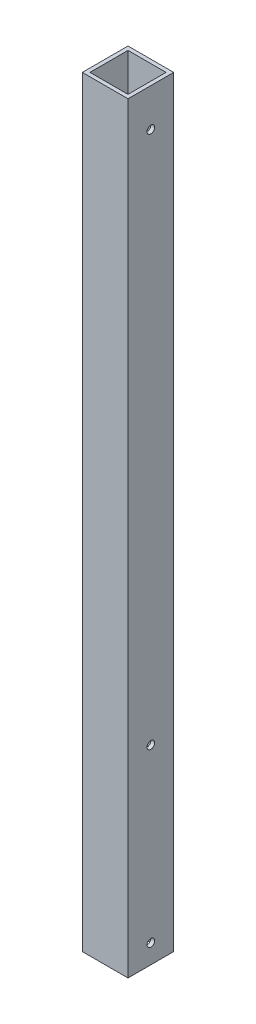
ISO-10303-21;
HEADER;
FILE_DESCRIPTION(('STEP AP214'),'2;1');
FILE_NAME('part.step','',(''),(''),'','','');
FILE_SCHEMA(('AUTOMOTIVE_DESIGN { 1 0 10303 214 1 1 1 1 }'));
ENDSEC;
DATA;
#1=APPLICATION_CONTEXT('core data for automotive mechanical design processes');
#2=APPLICATION_PROTOCOL_DEFINITION('international standard','automotive_design',2000,#1);
#3=PRODUCT_CONTEXT('',#1,'mechanical');
#4=PRODUCT('Part','Part','',(#3));
#5=PRODUCT_RELATED_PRODUCT_CATEGORY('part','',(#4));
#6=PRODUCT_DEFINITION_FORMATION('','',#4);
#7=PRODUCT_DEFINITION_CONTEXT('part definition',#1,'design');
#8=PRODUCT_DEFINITION('design','',#6,#7);
#9=PRODUCT_DEFINITION_SHAPE('','',#8);
#10=(LENGTH_UNIT() NAMED_UNIT(*) SI_UNIT(.MILLI.,.METRE.));
#11=(NAMED_UNIT(*) PLANE_ANGLE_UNIT() SI_UNIT($,.RADIAN.));
#12=(NAMED_UNIT(*) SI_UNIT($,.STERADIAN.) SOLID_ANGLE_UNIT());
#13=UNCERTAINTY_MEASURE_WITH_UNIT(LENGTH_MEASURE(1.E-05),#10,'distance_accuracy_value','');
#14=(GEOMETRIC_REPRESENTATION_CONTEXT(3) GLOBAL_UNCERTAINTY_ASSIGNED_CONTEXT((#13)) GLOBAL_UNIT_ASSIGNED_CONTEXT((#10,
#11,#12)) REPRESENTATION_CONTEXT('',''));
#15=CARTESIAN_POINT('',(0.,0.,0.));
#16=DIRECTION('',(0.,0.,1.));
#17=DIRECTION('',(1.,0.,0.));
#18=AXIS2_PLACEMENT_3D('',#15,#16,#17);
#19=CARTESIAN_POINT('',(0.,200.,0.));
#20=DIRECTION('',(0.,-1.,0.));
#21=DIRECTION('',(0.,0.,-1.));
#22=AXIS2_PLACEMENT_3D('',#19,#20,#21);
#23=PLANE('',#22);
#24=DIRECTION('',(0.,0.,-1.));
#25=VECTOR('',#24,1.);
#26=CARTESIAN_POINT('',(0.999999999999999,200.,-0.999999999999999));
#27=LINE('',#26,#25);
#28=CARTESIAN_POINT('',(0.999999999999999,200.,-0.999999999999999));
#29=VERTEX_POINT('',#28);
#30=CARTESIAN_POINT('',(0.999999999999999,200.,-11.));
#31=VERTEX_POINT('',#30);
#32=EDGE_CURVE('E117',#29,#31,#27,.T.);
#33=ORIENTED_EDGE('',*,*,#32,.T.);
#34=DIRECTION('',(1.,0.,0.));
#35=VECTOR('',#34,1.);
#36=CARTESIAN_POINT('',(0.999999999999999,200.,-11.));
#37=LINE('',#36,#35);
#38=CARTESIAN_POINT('',(11.,200.,-11.));
#39=VERTEX_POINT('',#38);
#40=EDGE_CURVE('E124',#31,#39,#37,.T.);
#41=ORIENTED_EDGE('',*,*,#40,.T.);
#42=DIRECTION('',(0.,0.,1.));
#43=VECTOR('',#42,1.);
#44=CARTESIAN_POINT('',(11.,200.,-11.));
#45=LINE('',#44,#43);
#46=CARTESIAN_POINT('',(11.,200.,-0.999999999999999));
#47=VERTEX_POINT('',#46);
#48=EDGE_CURVE('E129',#39,#47,#45,.T.);
#49=ORIENTED_EDGE('',*,*,#48,.T.);
#50=DIRECTION('',(-1.,0.,0.));
#51=VECTOR('',#50,1.);
#52=CARTESIAN_POINT('',(11.,200.,-0.999999999999999));
#53=LINE('',#52,#51);
#54=EDGE_CURVE('E56',#47,#29,#53,.T.);
#55=ORIENTED_EDGE('',*,*,#54,.T.);
#56=EDGE_LOOP('',(#33,#41,#49,#55));
#57=FACE_BOUND('',#56,.T.);
#58=DIRECTION('',(0.,0.,1.));
#59=VECTOR('',#58,1.);
#60=CARTESIAN_POINT('',(0.,200.,0.));
#61=LINE('',#60,#59);
#62=CARTESIAN_POINT('',(0.,200.,-12.));
#63=VERTEX_POINT('',#62);
#64=CARTESIAN_POINT('',(0.,200.,0.));
#65=VERTEX_POINT('',#64);
#66=EDGE_CURVE('E168',#63,#65,#61,.T.);
#67=ORIENTED_EDGE('',*,*,#66,.T.);
#68=DIRECTION('',(1.,0.,0.));
#69=VECTOR('',#68,1.);
#70=CARTESIAN_POINT('',(0.,200.,0.));
#71=LINE('',#70,#69);
#72=CARTESIAN_POINT('',(12.,200.,0.));
#73=VERTEX_POINT('',#72);
#74=EDGE_CURVE('E172',#65,#73,#71,.T.);
#75=ORIENTED_EDGE('',*,*,#74,.T.);
#76=DIRECTION('',(0.,0.,-1.));
#77=VECTOR('',#76,1.);
#78=CARTESIAN_POINT('',(12.,200.,0.));
#79=LINE('',#78,#77);
#80=CARTESIAN_POINT('',(12.,200.,-12.));
#81=VERTEX_POINT('',#80);
#82=EDGE_CURVE('E176',#73,#81,#79,.T.);
#83=ORIENTED_EDGE('',*,*,#82,.T.);
#84=DIRECTION('',(-1.,0.,0.));
#85=VECTOR('',#84,1.);
#86=CARTESIAN_POINT('',(0.,200.,-12.));
#87=LINE('',#86,#85);
#88=EDGE_CURVE('E179',#81,#63,#87,.T.);
#89=ORIENTED_EDGE('',*,*,#88,.T.);
#90=EDGE_LOOP('',(#67,#75,#83,#89));
#91=FACE_BOUND('',#90,.T.);
#92=ADVANCED_FACE('F38',(#57,#91),#23,.F.);
#93=CARTESIAN_POINT('',(0.,0.,0.));
#94=DIRECTION('',(0.,-1.,0.));
#95=DIRECTION('',(0.,0.,-1.));
#96=AXIS2_PLACEMENT_3D('',#93,#94,#95);
#97=PLANE('',#96);
#98=DIRECTION('',(1.,0.,0.));
#99=VECTOR('',#98,1.);
#100=CARTESIAN_POINT('',(0.999999999999999,0.,-11.));
#101=LINE('',#100,#99);
#102=CARTESIAN_POINT('',(0.999999999999999,0.,-11.));
#103=VERTEX_POINT('',#102);
#104=CARTESIAN_POINT('',(11.,0.,-11.));
#105=VERTEX_POINT('',#104);
#106=EDGE_CURVE('E64',#103,#105,#101,.T.);
#107=ORIENTED_EDGE('',*,*,#106,.F.);
#108=DIRECTION('',(0.,0.,-1.));
#109=VECTOR('',#108,1.);
#110=CARTESIAN_POINT('',(0.999999999999999,0.,-0.999999999999999));
#111=LINE('',#110,#109);
#112=CARTESIAN_POINT('',(0.999999999999999,0.,-0.999999999999999));
#113=VERTEX_POINT('',#112);
#114=EDGE_CURVE('E145',#113,#103,#111,.T.);
#115=ORIENTED_EDGE('',*,*,#114,.F.);
#116=DIRECTION('',(-1.,0.,0.));
#117=VECTOR('',#116,1.);
#118=CARTESIAN_POINT('',(11.,0.,-0.999999999999999));
#119=LINE('',#118,#117);
#120=CARTESIAN_POINT('',(11.,0.,-0.999999999999999));
#121=VERTEX_POINT('',#120);
#122=EDGE_CURVE('E108',#121,#113,#119,.T.);
#123=ORIENTED_EDGE('',*,*,#122,.F.);
#124=DIRECTION('',(0.,0.,1.));
#125=VECTOR('',#124,1.);
#126=CARTESIAN_POINT('',(11.,0.,-6.));
#127=LINE('',#126,#125);
#128=EDGE_CURVE('E138',#105,#121,#127,.T.);
#129=ORIENTED_EDGE('',*,*,#128,.F.);
#130=EDGE_LOOP('',(#107,#115,#123,#129));
#131=FACE_BOUND('',#130,.T.);
#132=DIRECTION('',(0.,0.,1.));
#133=VECTOR('',#132,1.);
#134=CARTESIAN_POINT('',(0.,0.,0.));
#135=LINE('',#134,#133);
#136=CARTESIAN_POINT('',(0.,0.,-12.));
#137=VERTEX_POINT('',#136);
#138=CARTESIAN_POINT('',(0.,0.,0.));
#139=VERTEX_POINT('',#138);
#140=EDGE_CURVE('E162',#137,#139,#135,.T.);
#141=ORIENTED_EDGE('',*,*,#140,.F.);
#142=DIRECTION('',(-1.,0.,0.));
#143=VECTOR('',#142,1.);
#144=CARTESIAN_POINT('',(0.,0.,-12.));
#145=LINE('',#144,#143);
#146=CARTESIAN_POINT('',(12.,0.,-12.));
#147=VERTEX_POINT('',#146);
#148=EDGE_CURVE('E173',#147,#137,#145,.T.);
#149=ORIENTED_EDGE('',*,*,#148,.F.);
#150=DIRECTION('',(0.,0.,-1.));
#151=VECTOR('',#150,1.);
#152=CARTESIAN_POINT('',(12.,0.,0.));
#153=LINE('',#152,#151);
#154=CARTESIAN_POINT('',(12.,0.,0.));
#155=VERTEX_POINT('',#154);
#156=EDGE_CURVE('E189',#155,#147,#153,.T.);
#157=ORIENTED_EDGE('',*,*,#156,.F.);
#158=DIRECTION('',(1.,0.,0.));
#159=VECTOR('',#158,1.);
#160=CARTESIAN_POINT('',(0.,0.,0.));
#161=LINE('',#160,#159);
#162=EDGE_CURVE('E186',#139,#155,#161,.T.);
#163=ORIENTED_EDGE('',*,*,#162,.F.);
#164=EDGE_LOOP('',(#141,#149,#157,#163));
#165=FACE_BOUND('',#164,.T.);
#166=ADVANCED_FACE('F260',(#131,#165),#97,.T.);
#167=CARTESIAN_POINT('',(0.,200.,0.));
#168=DIRECTION('',(1.,0.,0.));
#169=DIRECTION('',(0.,0.,-1.));
#170=AXIS2_PLACEMENT_3D('',#167,#168,#169);
#171=PLANE('',#170);
#172=CARTESIAN_POINT('',(0.,50.,-6.));
#173=DIRECTION('',(-1.,0.,0.));
#174=DIRECTION('',(0.,0.,1.));
#175=AXIS2_PLACEMENT_3D('',#172,#173,#174);
#176=CIRCLE('',#175,1.);
#177=CARTESIAN_POINT('',(0.,50.,-5.));
#178=VERTEX_POINT('',#177);
#179=EDGE_CURVE('E231',#178,#178,#176,.T.);
#180=ORIENTED_EDGE('',*,*,#179,.F.);
#181=EDGE_LOOP('',(#180));
#182=FACE_BOUND('',#181,.T.);
#183=CARTESIAN_POINT('',(0.,5.,-6.));
#184=DIRECTION('',(1.,0.,0.));
#185=DIRECTION('',(0.,0.,-1.));
#186=AXIS2_PLACEMENT_3D('',#183,#184,#185);
#187=CIRCLE('',#186,1.);
#188=CARTESIAN_POINT('',(0.,5.,-7.));
#189=VERTEX_POINT('',#188);
#190=EDGE_CURVE('E212',#189,#189,#187,.T.);
#191=ORIENTED_EDGE('',*,*,#190,.T.);
#192=EDGE_LOOP('',(#191));
#193=FACE_BOUND('',#192,.T.);
#194=CARTESIAN_POINT('',(0.,190.,-6.));
#195=DIRECTION('',(-1.,0.,0.));
#196=DIRECTION('',(0.,0.,1.));
#197=AXIS2_PLACEMENT_3D('',#194,#195,#196);
#198=CIRCLE('',#197,1.);
#199=CARTESIAN_POINT('',(0.,190.,-5.));
#200=VERTEX_POINT('',#199);
#201=EDGE_CURVE('E163',#200,#200,#198,.T.);
#202=ORIENTED_EDGE('',*,*,#201,.F.);
#203=EDGE_LOOP('',(#202));
#204=FACE_BOUND('',#203,.T.);
#205=ORIENTED_EDGE('',*,*,#140,.T.);
#206=DIRECTION('',(0.,-1.,0.));
#207=VECTOR('',#206,1.);
#208=CARTESIAN_POINT('',(0.,200.,0.));
#209=LINE('',#208,#207);
#210=EDGE_CURVE('E11',#65,#139,#209,.T.);
#211=ORIENTED_EDGE('',*,*,#210,.F.);
#212=ORIENTED_EDGE('',*,*,#66,.F.);
#213=DIRECTION('',(0.,-1.,0.));
#214=VECTOR('',#213,1.);
#215=CARTESIAN_POINT('',(0.,200.,-12.));
#216=LINE('',#215,#214);
#217=EDGE_CURVE('E182',#63,#137,#216,.T.);
#218=ORIENTED_EDGE('',*,*,#217,.T.);
#219=EDGE_LOOP('',(#205,#211,#212,#218));
#220=FACE_BOUND('',#219,.T.);
#221=ADVANCED_FACE('F40',(#182,#193,#204,#220),#171,.F.);
#222=CARTESIAN_POINT('',(0.,200.,0.));
#223=DIRECTION('',(0.,0.,-1.));
#224=DIRECTION('',(-1.,0.,0.));
#225=AXIS2_PLACEMENT_3D('',#222,#223,#224);
#226=PLANE('',#225);
#227=ORIENTED_EDGE('',*,*,#162,.T.);
#228=DIRECTION('',(0.,-1.,0.));
#229=VECTOR('',#228,1.);
#230=CARTESIAN_POINT('',(12.,200.,0.));
#231=LINE('',#230,#229);
#232=EDGE_CURVE('E48',#73,#155,#231,.T.);
#233=ORIENTED_EDGE('',*,*,#232,.F.);
#234=ORIENTED_EDGE('',*,*,#74,.F.);
#235=ORIENTED_EDGE('',*,*,#210,.T.);
#236=EDGE_LOOP('',(#227,#233,#234,#235));
#237=FACE_BOUND('',#236,.T.);
#238=ADVANCED_FACE('F277',(#237),#226,.F.);
#239=CARTESIAN_POINT('',(12.,200.,0.));
#240=DIRECTION('',(-1.,0.,0.));
#241=DIRECTION('',(0.,0.,1.));
#242=AXIS2_PLACEMENT_3D('',#239,#240,#241);
#243=PLANE('',#242);
#244=CARTESIAN_POINT('',(12.,50.,-6.));
#245=DIRECTION('',(-1.,0.,0.));
#246=DIRECTION('',(0.,0.,1.));
#247=AXIS2_PLACEMENT_3D('',#244,#245,#246);
#248=CIRCLE('',#247,1.);
#249=CARTESIAN_POINT('',(12.,50.,-5.));
#250=VERTEX_POINT('',#249);
#251=EDGE_CURVE('E235',#250,#250,#248,.T.);
#252=ORIENTED_EDGE('',*,*,#251,.T.);
#253=EDGE_LOOP('',(#252));
#254=FACE_BOUND('',#253,.T.);
#255=CARTESIAN_POINT('',(12.,5.,-6.));
#256=DIRECTION('',(1.,0.,0.));
#257=DIRECTION('',(0.,0.,-1.));
#258=AXIS2_PLACEMENT_3D('',#255,#256,#257);
#259=CIRCLE('',#258,1.);
#260=CARTESIAN_POINT('',(12.,5.,-7.));
#261=VERTEX_POINT('',#260);
#262=EDGE_CURVE('E219',#261,#261,#259,.T.);
#263=ORIENTED_EDGE('',*,*,#262,.F.);
#264=EDGE_LOOP('',(#263));
#265=FACE_BOUND('',#264,.T.);
#266=CARTESIAN_POINT('',(12.,190.,-6.));
#267=DIRECTION('',(-1.,0.,0.));
#268=DIRECTION('',(0.,0.,1.));
#269=AXIS2_PLACEMENT_3D('',#266,#267,#268);
#270=CIRCLE('',#269,1.);
#271=CARTESIAN_POINT('',(12.,190.,-5.));
#272=VERTEX_POINT('',#271);
#273=EDGE_CURVE('E158',#272,#272,#270,.T.);
#274=ORIENTED_EDGE('',*,*,#273,.T.);
#275=EDGE_LOOP('',(#274));
#276=FACE_BOUND('',#275,.T.);
#277=ORIENTED_EDGE('',*,*,#156,.T.);
#278=DIRECTION('',(0.,-1.,0.));
#279=VECTOR('',#278,1.);
#280=CARTESIAN_POINT('',(12.,200.,-12.));
#281=LINE('',#280,#279);
#282=EDGE_CURVE('E197',#81,#147,#281,.T.);
#283=ORIENTED_EDGE('',*,*,#282,.F.);
#284=ORIENTED_EDGE('',*,*,#82,.F.);
#285=ORIENTED_EDGE('',*,*,#232,.T.);
#286=EDGE_LOOP('',(#277,#283,#284,#285));
#287=FACE_BOUND('',#286,.T.);
#288=ADVANCED_FACE('F274',(#254,#265,#276,#287),#243,.F.);
#289=CARTESIAN_POINT('',(0.,200.,-12.));
#290=DIRECTION('',(0.,0.,1.));
#291=DIRECTION('',(1.,0.,0.));
#292=AXIS2_PLACEMENT_3D('',#289,#290,#291);
#293=PLANE('',#292);
#294=ORIENTED_EDGE('',*,*,#148,.T.);
#295=ORIENTED_EDGE('',*,*,#217,.F.);
#296=ORIENTED_EDGE('',*,*,#88,.F.);
#297=ORIENTED_EDGE('',*,*,#282,.T.);
#298=EDGE_LOOP('',(#294,#295,#296,#297));
#299=FACE_BOUND('',#298,.T.);
#300=ADVANCED_FACE('F271',(#299),#293,.F.);
#301=CARTESIAN_POINT('',(12.,190.,-6.));
#302=DIRECTION('',(-1.,0.,0.));
#303=DIRECTION('',(0.,0.,1.));
#304=AXIS2_PLACEMENT_3D('',#301,#302,#303);
#305=CYLINDRICAL_SURFACE('',#304,1.);
#306=CARTESIAN_POINT('',(11.,190.,-6.));
#307=DIRECTION('',(1.,0.,0.));
#308=DIRECTION('',(0.,0.,-1.));
#309=AXIS2_PLACEMENT_3D('',#306,#307,#308);
#310=CIRCLE('',#309,1.);
#311=CARTESIAN_POINT('',(11.,190.,-7.));
#312=VERTEX_POINT('',#311);
#313=EDGE_CURVE('E167',#312,#312,#310,.F.);
#314=ORIENTED_EDGE('',*,*,#313,.T.);
#315=EDGE_LOOP('',(#314));
#316=FACE_BOUND('',#315,.T.);
#317=ORIENTED_EDGE('',*,*,#273,.F.);
#318=EDGE_LOOP('',(#317));
#319=FACE_BOUND('',#318,.T.);
#320=ADVANCED_FACE('F268',(#316,#319),#305,.F.);
#321=CARTESIAN_POINT('',(0.999999999999999,190.,-6.));
#322=DIRECTION('',(-1.,0.,0.));
#323=DIRECTION('',(0.,0.,1.));
#324=AXIS2_PLACEMENT_3D('',#321,#322,#323);
#325=CIRCLE('',#324,1.);
#326=CARTESIAN_POINT('',(0.999999999999999,190.,-5.));
#327=VERTEX_POINT('',#326);
#328=EDGE_CURVE('E153',#327,#327,#325,.F.);
#329=ORIENTED_EDGE('',*,*,#328,.T.);
#330=EDGE_LOOP('',(#329));
#331=FACE_BOUND('',#330,.T.);
#332=ORIENTED_EDGE('',*,*,#201,.T.);
#333=EDGE_LOOP('',(#332));
#334=FACE_BOUND('',#333,.T.);
#335=ADVANCED_FACE('F305',(#331,#334),#305,.F.);
#336=CARTESIAN_POINT('',(11.,200.,-6.));
#337=DIRECTION('',(1.,0.,0.));
#338=DIRECTION('',(0.,0.,-1.));
#339=AXIS2_PLACEMENT_3D('',#336,#337,#338);
#340=PLANE('',#339);
#341=CARTESIAN_POINT('',(11.,50.,-6.));
#342=DIRECTION('',(1.,0.,0.));
#343=DIRECTION('',(0.,0.,-1.));
#344=AXIS2_PLACEMENT_3D('',#341,#342,#343);
#345=CIRCLE('',#344,1.);
#346=CARTESIAN_POINT('',(11.,50.,-7.));
#347=VERTEX_POINT('',#346);
#348=EDGE_CURVE('E225',#347,#347,#345,.T.);
#349=ORIENTED_EDGE('',*,*,#348,.T.);
#350=EDGE_LOOP('',(#349));
#351=FACE_BOUND('',#350,.T.);
#352=CARTESIAN_POINT('',(11.,5.,-6.));
#353=DIRECTION('',(1.,0.,0.));
#354=DIRECTION('',(0.,0.,-1.));
#355=AXIS2_PLACEMENT_3D('',#352,#353,#354);
#356=CIRCLE('',#355,1.);
#357=CARTESIAN_POINT('',(11.,5.,-7.));
#358=VERTEX_POINT('',#357);
#359=EDGE_CURVE('E142',#358,#358,#356,.T.);
#360=ORIENTED_EDGE('',*,*,#359,.T.);
#361=EDGE_LOOP('',(#360));
#362=FACE_BOUND('',#361,.T.);
#363=ORIENTED_EDGE('',*,*,#128,.T.);
#364=DIRECTION('',(0.,-1.,0.));
#365=VECTOR('',#364,1.);
#366=CARTESIAN_POINT('',(11.,200.,-0.999999999999999));
#367=LINE('',#366,#365);
#368=EDGE_CURVE('E114',#47,#121,#367,.T.);
#369=ORIENTED_EDGE('',*,*,#368,.F.);
#370=ORIENTED_EDGE('',*,*,#48,.F.);
#371=DIRECTION('',(0.,-1.,0.));
#372=VECTOR('',#371,1.);
#373=CARTESIAN_POINT('',(11.,200.,-11.));
#374=LINE('',#373,#372);
#375=EDGE_CURVE('E150',#39,#105,#374,.T.);
#376=ORIENTED_EDGE('',*,*,#375,.T.);
#377=EDGE_LOOP('',(#363,#369,#370,#376));
#378=FACE_BOUND('',#377,.T.);
#379=ORIENTED_EDGE('',*,*,#313,.F.);
#380=EDGE_LOOP('',(#379));
#381=FACE_BOUND('',#380,.T.);
#382=ADVANCED_FACE('F307',(#351,#362,#378,#381),#340,.F.);
#383=CARTESIAN_POINT('',(0.999999999999999,200.,-0.999999999999999));
#384=DIRECTION('',(-1.,0.,0.));
#385=DIRECTION('',(0.,0.,1.));
#386=AXIS2_PLACEMENT_3D('',#383,#384,#385);
#387=PLANE('',#386);
#388=CARTESIAN_POINT('',(0.999999999999999,50.,-6.));
#389=DIRECTION('',(-1.,0.,0.));
#390=DIRECTION('',(0.,0.,1.));
#391=AXIS2_PLACEMENT_3D('',#388,#389,#390);
#392=CIRCLE('',#391,1.);
#393=CARTESIAN_POINT('',(0.999999999999999,50.,-5.));
#394=VERTEX_POINT('',#393);
#395=EDGE_CURVE('E42',#394,#394,#392,.T.);
#396=ORIENTED_EDGE('',*,*,#395,.T.);
#397=EDGE_LOOP('',(#396));
#398=FACE_BOUND('',#397,.T.);
#399=CARTESIAN_POINT('',(0.999999999999999,5.,-6.));
#400=DIRECTION('',(-1.,0.,0.));
#401=DIRECTION('',(0.,0.,1.));
#402=AXIS2_PLACEMENT_3D('',#399,#400,#401);
#403=CIRCLE('',#402,1.);
#404=CARTESIAN_POINT('',(0.999999999999999,5.,-5.));
#405=VERTEX_POINT('',#404);
#406=EDGE_CURVE('E209',#405,#405,#403,.T.);
#407=ORIENTED_EDGE('',*,*,#406,.T.);
#408=EDGE_LOOP('',(#407));
#409=FACE_BOUND('',#408,.T.);
#410=ORIENTED_EDGE('',*,*,#114,.T.);
#411=DIRECTION('',(0.,-1.,0.));
#412=VECTOR('',#411,1.);
#413=CARTESIAN_POINT('',(0.999999999999999,200.,-11.));
#414=LINE('',#413,#412);
#415=EDGE_CURVE('E113',#31,#103,#414,.T.);
#416=ORIENTED_EDGE('',*,*,#415,.F.);
#417=ORIENTED_EDGE('',*,*,#32,.F.);
#418=DIRECTION('',(0.,-1.,0.));
#419=VECTOR('',#418,1.);
#420=CARTESIAN_POINT('',(0.999999999999999,200.,-0.999999999999999));
#421=LINE('',#420,#419);
#422=EDGE_CURVE('E104',#29,#113,#421,.T.);
#423=ORIENTED_EDGE('',*,*,#422,.T.);
#424=EDGE_LOOP('',(#410,#416,#417,#423));
#425=FACE_BOUND('',#424,.T.);
#426=ORIENTED_EDGE('',*,*,#328,.F.);
#427=EDGE_LOOP('',(#426));
#428=FACE_BOUND('',#427,.T.);
#429=ADVANCED_FACE('F118',(#398,#409,#425,#428),#387,.F.);
#430=CARTESIAN_POINT('',(0.999999999999999,200.,-11.));
#431=DIRECTION('',(0.,0.,-1.));
#432=DIRECTION('',(-1.,0.,0.));
#433=AXIS2_PLACEMENT_3D('',#430,#431,#432);
#434=PLANE('',#433);
#435=ORIENTED_EDGE('',*,*,#106,.T.);
#436=ORIENTED_EDGE('',*,*,#375,.F.);
#437=ORIENTED_EDGE('',*,*,#40,.F.);
#438=ORIENTED_EDGE('',*,*,#415,.T.);
#439=EDGE_LOOP('',(#435,#436,#437,#438));
#440=FACE_BOUND('',#439,.T.);
#441=ADVANCED_FACE('F318',(#440),#434,.F.);
#442=CARTESIAN_POINT('',(11.,200.,-0.999999999999999));
#443=DIRECTION('',(0.,0.,1.));
#444=DIRECTION('',(1.,0.,0.));
#445=AXIS2_PLACEMENT_3D('',#442,#443,#444);
#446=PLANE('',#445);
#447=ORIENTED_EDGE('',*,*,#122,.T.);
#448=ORIENTED_EDGE('',*,*,#422,.F.);
#449=ORIENTED_EDGE('',*,*,#54,.F.);
#450=ORIENTED_EDGE('',*,*,#368,.T.);
#451=EDGE_LOOP('',(#447,#448,#449,#450));
#452=FACE_BOUND('',#451,.T.);
#453=ADVANCED_FACE('F106',(#452),#446,.F.);
#454=CARTESIAN_POINT('',(0.,5.,-6.));
#455=DIRECTION('',(1.,0.,0.));
#456=DIRECTION('',(0.,0.,-1.));
#457=AXIS2_PLACEMENT_3D('',#454,#455,#456);
#458=CYLINDRICAL_SURFACE('',#457,1.);
#459=ORIENTED_EDGE('',*,*,#190,.F.);
#460=EDGE_LOOP('',(#459));
#461=FACE_BOUND('',#460,.T.);
#462=ORIENTED_EDGE('',*,*,#406,.F.);
#463=EDGE_LOOP('',(#462));
#464=FACE_BOUND('',#463,.T.);
#465=ADVANCED_FACE('F256',(#461,#464),#458,.F.);
#466=ORIENTED_EDGE('',*,*,#262,.T.);
#467=EDGE_LOOP('',(#466));
#468=FACE_BOUND('',#467,.T.);
#469=ORIENTED_EDGE('',*,*,#359,.F.);
#470=EDGE_LOOP('',(#469));
#471=FACE_BOUND('',#470,.T.);
#472=ADVANCED_FACE('F248',(#468,#471),#458,.F.);
#473=CARTESIAN_POINT('',(12.,50.,-6.));
#474=DIRECTION('',(-1.,0.,0.));
#475=DIRECTION('',(0.,0.,1.));
#476=AXIS2_PLACEMENT_3D('',#473,#474,#475);
#477=CYLINDRICAL_SURFACE('',#476,1.);
#478=ORIENTED_EDGE('',*,*,#179,.T.);
#479=EDGE_LOOP('',(#478));
#480=FACE_BOUND('',#479,.T.);
#481=ORIENTED_EDGE('',*,*,#395,.F.);
#482=EDGE_LOOP('',(#481));
#483=FACE_BOUND('',#482,.T.);
#484=ADVANCED_FACE('F245',(#480,#483),#477,.F.);
#485=ORIENTED_EDGE('',*,*,#251,.F.);
#486=EDGE_LOOP('',(#485));
#487=FACE_BOUND('',#486,.T.);
#488=ORIENTED_EDGE('',*,*,#348,.F.);
#489=EDGE_LOOP('',(#488));
#490=FACE_BOUND('',#489,.T.);
#491=ADVANCED_FACE('F247',(#487,#490),#477,.F.);
#492=CLOSED_SHELL('',(#92,#166,#221,#238,#288,#300,#320,#335,#382,#429,#441,#453,#465,#472,#484,#491));
#493=MANIFOLD_SOLID_BREP('B2',#492);
#494=ADVANCED_BREP_SHAPE_REPRESENTATION('',(#18,#493),#14);
#495=SHAPE_DEFINITION_REPRESENTATION(#9,#494);
ENDSEC;
END-ISO-10303-21;
